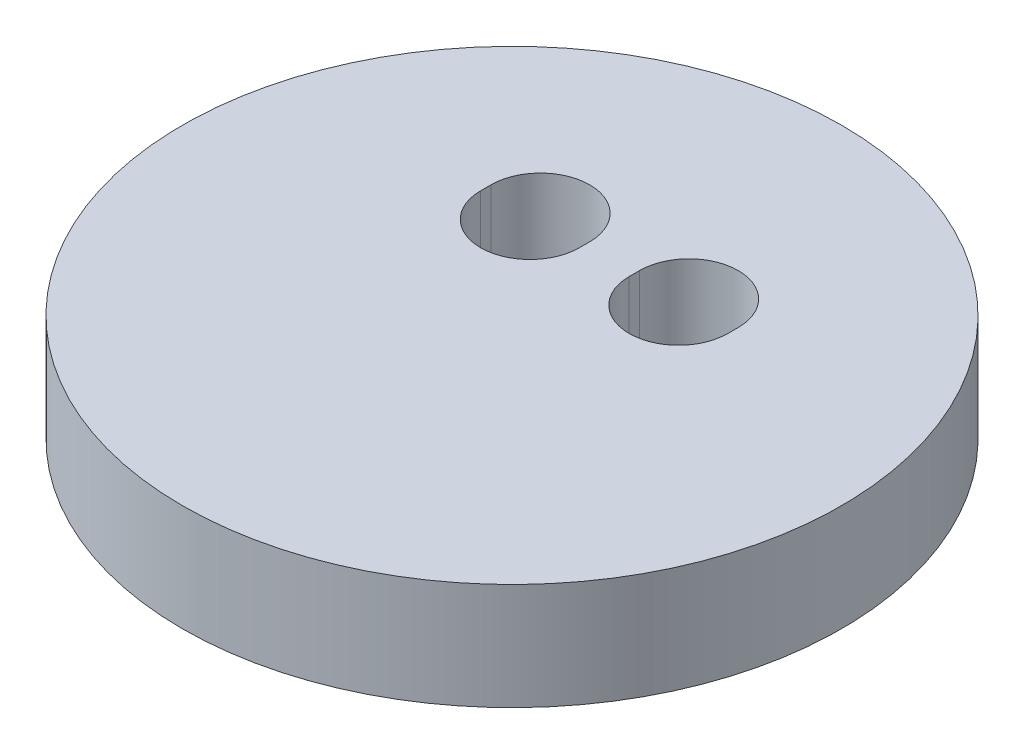
ISO-10303-21;
HEADER;
FILE_DESCRIPTION(('STEP AP214'),'2;1');
FILE_NAME('part.step','',(''),(''),'','','');
FILE_SCHEMA(('AUTOMOTIVE_DESIGN { 1 0 10303 214 1 1 1 1 }'));
ENDSEC;
DATA;
#1=APPLICATION_CONTEXT('core data for automotive mechanical design processes');
#2=APPLICATION_PROTOCOL_DEFINITION('international standard','automotive_design',2000,#1);
#3=PRODUCT_CONTEXT('',#1,'mechanical');
#4=PRODUCT('Part','Part','',(#3));
#5=PRODUCT_RELATED_PRODUCT_CATEGORY('part','',(#4));
#6=PRODUCT_DEFINITION_FORMATION('','',#4);
#7=PRODUCT_DEFINITION_CONTEXT('part definition',#1,'design');
#8=PRODUCT_DEFINITION('design','',#6,#7);
#9=PRODUCT_DEFINITION_SHAPE('','',#8);
#10=(LENGTH_UNIT() NAMED_UNIT(*) SI_UNIT(.MILLI.,.METRE.));
#11=(NAMED_UNIT(*) PLANE_ANGLE_UNIT() SI_UNIT($,.RADIAN.));
#12=(NAMED_UNIT(*) SI_UNIT($,.STERADIAN.) SOLID_ANGLE_UNIT());
#13=UNCERTAINTY_MEASURE_WITH_UNIT(LENGTH_MEASURE(1.E-05),#10,'distance_accuracy_value','');
#14=(GEOMETRIC_REPRESENTATION_CONTEXT(3) GLOBAL_UNCERTAINTY_ASSIGNED_CONTEXT((#13)) GLOBAL_UNIT_ASSIGNED_CONTEXT((#10,
#11,#12)) REPRESENTATION_CONTEXT('',''));
#15=CARTESIAN_POINT('',(0.,0.,0.));
#16=DIRECTION('',(0.,0.,1.));
#17=DIRECTION('',(1.,0.,0.));
#18=AXIS2_PLACEMENT_3D('',#15,#16,#17);
#19=CARTESIAN_POINT('',(0.,4.,0.));
#20=DIRECTION('',(0.,-1.,0.));
#21=DIRECTION('',(0.,0.,-1.));
#22=AXIS2_PLACEMENT_3D('',#19,#20,#21);
#23=CYLINDRICAL_SURFACE('',#22,12.36);
#24=CARTESIAN_POINT('',(0.,4.,0.));
#25=DIRECTION('',(0.,1.,0.));
#26=DIRECTION('',(0.,0.,1.));
#27=AXIS2_PLACEMENT_3D('',#24,#25,#26);
#28=CIRCLE('',#27,12.36);
#29=CARTESIAN_POINT('',(0.,4.,12.36));
#30=VERTEX_POINT('',#29);
#31=EDGE_CURVE('E11',#30,#30,#28,.T.);
#32=ORIENTED_EDGE('',*,*,#31,.F.);
#33=EDGE_LOOP('',(#32));
#34=FACE_BOUND('',#33,.T.);
#35=CARTESIAN_POINT('',(0.,0.,0.));
#36=DIRECTION('',(0.,1.,0.));
#37=DIRECTION('',(0.,0.,1.));
#38=AXIS2_PLACEMENT_3D('',#35,#36,#37);
#39=CIRCLE('',#38,12.36);
#40=CARTESIAN_POINT('',(0.,0.,12.36));
#41=VERTEX_POINT('',#40);
#42=EDGE_CURVE('E46',#41,#41,#39,.T.);
#43=ORIENTED_EDGE('',*,*,#42,.T.);
#44=EDGE_LOOP('',(#43));
#45=FACE_BOUND('',#44,.T.);
#46=ADVANCED_FACE('F43',(#34,#45),#23,.T.);
#47=CARTESIAN_POINT('',(0.,4.,0.));
#48=DIRECTION('',(0.,1.,0.));
#49=DIRECTION('',(0.,0.,1.));
#50=AXIS2_PLACEMENT_3D('',#47,#48,#49);
#51=PLANE('',#50);
#52=CARTESIAN_POINT('',(-2.785,4.,-3.85));
#53=DIRECTION('',(0.,1.,0.));
#54=DIRECTION('',(0.,0.,1.));
#55=AXIS2_PLACEMENT_3D('',#52,#53,#54);
#56=CIRCLE('',#55,1.85);
#57=CARTESIAN_POINT('',(-0.935000000000001,4.,-3.85));
#58=VERTEX_POINT('',#57);
#59=CARTESIAN_POINT('',(-4.635,4.,-3.85));
#60=VERTEX_POINT('',#59);
#61=EDGE_CURVE('E58',#58,#60,#56,.T.);
#62=ORIENTED_EDGE('',*,*,#61,.F.);
#63=DIRECTION('',(0.,0.,-1.));
#64=VECTOR('',#63,1.);
#65=CARTESIAN_POINT('',(-0.935000000000001,4.,-3.85));
#66=LINE('',#65,#64);
#67=CARTESIAN_POINT('',(-0.935000000000001,4.,-3.46000000000001));
#68=VERTEX_POINT('',#67);
#69=EDGE_CURVE('E132',#68,#58,#66,.T.);
#70=ORIENTED_EDGE('',*,*,#69,.F.);
#71=CARTESIAN_POINT('',(-2.785,4.,-3.46));
#72=DIRECTION('',(0.,1.,0.));
#73=DIRECTION('',(0.,0.,1.));
#74=AXIS2_PLACEMENT_3D('',#71,#72,#73);
#75=CIRCLE('',#74,1.85);
#76=CARTESIAN_POINT('',(-4.635,4.,-3.46));
#77=VERTEX_POINT('',#76);
#78=EDGE_CURVE('E136',#77,#68,#75,.T.);
#79=ORIENTED_EDGE('',*,*,#78,.F.);
#80=DIRECTION('',(0.,0.,1.));
#81=VECTOR('',#80,1.);
#82=CARTESIAN_POINT('',(-4.635,4.,-3.85));
#83=LINE('',#82,#81);
#84=EDGE_CURVE('E145',#60,#77,#83,.T.);
#85=ORIENTED_EDGE('',*,*,#84,.F.);
#86=EDGE_LOOP('',(#62,#70,#79,#85));
#87=FACE_BOUND('',#86,.T.);
#88=CARTESIAN_POINT('',(2.785,4.,-3.85));
#89=DIRECTION('',(0.,1.,0.));
#90=DIRECTION('',(0.,0.,1.));
#91=AXIS2_PLACEMENT_3D('',#88,#89,#90);
#92=CIRCLE('',#91,1.85);
#93=CARTESIAN_POINT('',(4.635,4.,-3.85));
#94=VERTEX_POINT('',#93);
#95=CARTESIAN_POINT('',(0.934999999999997,4.,-3.85));
#96=VERTEX_POINT('',#95);
#97=EDGE_CURVE('E66',#94,#96,#92,.T.);
#98=ORIENTED_EDGE('',*,*,#97,.F.);
#99=DIRECTION('',(0.,0.,-1.));
#100=VECTOR('',#99,1.);
#101=CARTESIAN_POINT('',(4.635,4.,-3.85));
#102=LINE('',#101,#100);
#103=CARTESIAN_POINT('',(4.635,4.,-3.46));
#104=VERTEX_POINT('',#103);
#105=EDGE_CURVE('E172',#104,#94,#102,.T.);
#106=ORIENTED_EDGE('',*,*,#105,.F.);
#107=CARTESIAN_POINT('',(2.785,4.,-3.46));
#108=DIRECTION('',(0.,1.,0.));
#109=DIRECTION('',(0.,0.,1.));
#110=AXIS2_PLACEMENT_3D('',#107,#108,#109);
#111=CIRCLE('',#110,1.85);
#112=CARTESIAN_POINT('',(0.934999999999996,4.,-3.46));
#113=VERTEX_POINT('',#112);
#114=EDGE_CURVE('E176',#113,#104,#111,.T.);
#115=ORIENTED_EDGE('',*,*,#114,.F.);
#116=DIRECTION('',(0.,0.,1.));
#117=VECTOR('',#116,1.);
#118=CARTESIAN_POINT('',(0.934999999999997,4.,-3.85));
#119=LINE('',#118,#117);
#120=EDGE_CURVE('E181',#96,#113,#119,.T.);
#121=ORIENTED_EDGE('',*,*,#120,.F.);
#122=EDGE_LOOP('',(#98,#106,#115,#121));
#123=FACE_BOUND('',#122,.T.);
#124=ORIENTED_EDGE('',*,*,#31,.T.);
#125=EDGE_LOOP('',(#124));
#126=FACE_BOUND('',#125,.T.);
#127=ADVANCED_FACE('F216',(#87,#123,#126),#51,.T.);
#128=CARTESIAN_POINT('',(0.,0.,0.));
#129=DIRECTION('',(0.,1.,0.));
#130=DIRECTION('',(0.,0.,1.));
#131=AXIS2_PLACEMENT_3D('',#128,#129,#130);
#132=PLANE('',#131);
#133=DIRECTION('',(0.,0.,-1.));
#134=VECTOR('',#133,1.);
#135=CARTESIAN_POINT('',(-0.935000000000001,0.,-3.85));
#136=LINE('',#135,#134);
#137=CARTESIAN_POINT('',(-0.935000000000001,0.,-3.46000000000001));
#138=VERTEX_POINT('',#137);
#139=CARTESIAN_POINT('',(-0.935000000000001,0.,-3.85));
#140=VERTEX_POINT('',#139);
#141=EDGE_CURVE('E117',#138,#140,#136,.T.);
#142=ORIENTED_EDGE('',*,*,#141,.T.);
#143=CARTESIAN_POINT('',(-2.785,0.,-3.85));
#144=DIRECTION('',(0.,1.,0.));
#145=DIRECTION('',(0.,0.,1.));
#146=AXIS2_PLACEMENT_3D('',#143,#144,#145);
#147=CIRCLE('',#146,1.85);
#148=CARTESIAN_POINT('',(-4.635,0.,-3.85));
#149=VERTEX_POINT('',#148);
#150=EDGE_CURVE('E110',#140,#149,#147,.T.);
#151=ORIENTED_EDGE('',*,*,#150,.T.);
#152=DIRECTION('',(0.,0.,1.));
#153=VECTOR('',#152,1.);
#154=CARTESIAN_POINT('',(-4.635,0.,-3.85));
#155=LINE('',#154,#153);
#156=CARTESIAN_POINT('',(-4.635,0.,-3.46));
#157=VERTEX_POINT('',#156);
#158=EDGE_CURVE('E121',#149,#157,#155,.T.);
#159=ORIENTED_EDGE('',*,*,#158,.T.);
#160=CARTESIAN_POINT('',(-2.785,0.,-3.46));
#161=DIRECTION('',(0.,1.,0.));
#162=DIRECTION('',(0.,0.,1.));
#163=AXIS2_PLACEMENT_3D('',#160,#161,#162);
#164=CIRCLE('',#163,1.85);
#165=EDGE_CURVE('E126',#157,#138,#164,.T.);
#166=ORIENTED_EDGE('',*,*,#165,.T.);
#167=EDGE_LOOP('',(#142,#151,#159,#166));
#168=FACE_BOUND('',#167,.T.);
#169=DIRECTION('',(0.,0.,-1.));
#170=VECTOR('',#169,1.);
#171=CARTESIAN_POINT('',(4.635,0.,-3.85));
#172=LINE('',#171,#170);
#173=CARTESIAN_POINT('',(4.635,0.,-3.46));
#174=VERTEX_POINT('',#173);
#175=CARTESIAN_POINT('',(4.635,0.,-3.85));
#176=VERTEX_POINT('',#175);
#177=EDGE_CURVE('E162',#174,#176,#172,.T.);
#178=ORIENTED_EDGE('',*,*,#177,.T.);
#179=CARTESIAN_POINT('',(2.785,0.,-3.85));
#180=DIRECTION('',(0.,1.,0.));
#181=DIRECTION('',(0.,0.,1.));
#182=AXIS2_PLACEMENT_3D('',#179,#180,#181);
#183=CIRCLE('',#182,1.85);
#184=CARTESIAN_POINT('',(0.934999999999997,0.,-3.85));
#185=VERTEX_POINT('',#184);
#186=EDGE_CURVE('E177',#176,#185,#183,.T.);
#187=ORIENTED_EDGE('',*,*,#186,.T.);
#188=DIRECTION('',(0.,0.,1.));
#189=VECTOR('',#188,1.);
#190=CARTESIAN_POINT('',(0.934999999999997,0.,-3.85));
#191=LINE('',#190,#189);
#192=CARTESIAN_POINT('',(0.934999999999997,0.,-3.46));
#193=VERTEX_POINT('',#192);
#194=EDGE_CURVE('E194',#185,#193,#191,.T.);
#195=ORIENTED_EDGE('',*,*,#194,.T.);
#196=CARTESIAN_POINT('',(2.785,0.,-3.46));
#197=DIRECTION('',(0.,1.,0.));
#198=DIRECTION('',(0.,0.,1.));
#199=AXIS2_PLACEMENT_3D('',#196,#197,#198);
#200=CIRCLE('',#199,1.85);
#201=EDGE_CURVE('E190',#193,#174,#200,.T.);
#202=ORIENTED_EDGE('',*,*,#201,.T.);
#203=EDGE_LOOP('',(#178,#187,#195,#202));
#204=FACE_BOUND('',#203,.T.);
#205=ORIENTED_EDGE('',*,*,#42,.F.);
#206=EDGE_LOOP('',(#205));
#207=FACE_BOUND('',#206,.T.);
#208=ADVANCED_FACE('F128',(#168,#204,#207),#132,.F.);
#209=CARTESIAN_POINT('',(2.785,0.,-3.85));
#210=DIRECTION('',(0.,1.,0.));
#211=DIRECTION('',(0.,0.,1.));
#212=AXIS2_PLACEMENT_3D('',#209,#210,#211);
#213=CYLINDRICAL_SURFACE('',#212,1.85);
#214=ORIENTED_EDGE('',*,*,#97,.T.);
#215=DIRECTION('',(0.,1.,0.));
#216=VECTOR('',#215,1.);
#217=CARTESIAN_POINT('',(0.934999999999997,0.,-3.85));
#218=LINE('',#217,#216);
#219=EDGE_CURVE('E159',#185,#96,#218,.T.);
#220=ORIENTED_EDGE('',*,*,#219,.F.);
#221=ORIENTED_EDGE('',*,*,#186,.F.);
#222=DIRECTION('',(0.,1.,0.));
#223=VECTOR('',#222,1.);
#224=CARTESIAN_POINT('',(4.635,0.,-3.85));
#225=LINE('',#224,#223);
#226=EDGE_CURVE('E169',#176,#94,#225,.T.);
#227=ORIENTED_EDGE('',*,*,#226,.T.);
#228=EDGE_LOOP('',(#214,#220,#221,#227));
#229=FACE_BOUND('',#228,.T.);
#230=ADVANCED_FACE('F204',(#229),#213,.F.);
#231=CARTESIAN_POINT('',(4.635,0.,-3.85));
#232=DIRECTION('',(1.,0.,0.));
#233=DIRECTION('',(0.,0.,-1.));
#234=AXIS2_PLACEMENT_3D('',#231,#232,#233);
#235=PLANE('',#234);
#236=ORIENTED_EDGE('',*,*,#105,.T.);
#237=ORIENTED_EDGE('',*,*,#226,.F.);
#238=ORIENTED_EDGE('',*,*,#177,.F.);
#239=DIRECTION('',(0.,1.,0.));
#240=VECTOR('',#239,1.);
#241=CARTESIAN_POINT('',(4.635,0.,-3.46));
#242=LINE('',#241,#240);
#243=EDGE_CURVE('E166',#174,#104,#242,.T.);
#244=ORIENTED_EDGE('',*,*,#243,.T.);
#245=EDGE_LOOP('',(#236,#237,#238,#244));
#246=FACE_BOUND('',#245,.T.);
#247=ADVANCED_FACE('F214',(#246),#235,.F.);
#248=CARTESIAN_POINT('',(2.785,0.,-3.46));
#249=DIRECTION('',(0.,1.,0.));
#250=DIRECTION('',(0.,0.,1.));
#251=AXIS2_PLACEMENT_3D('',#248,#249,#250);
#252=CYLINDRICAL_SURFACE('',#251,1.85);
#253=ORIENTED_EDGE('',*,*,#114,.T.);
#254=ORIENTED_EDGE('',*,*,#243,.F.);
#255=ORIENTED_EDGE('',*,*,#201,.F.);
#256=DIRECTION('',(0.,1.,0.));
#257=VECTOR('',#256,1.);
#258=CARTESIAN_POINT('',(0.934999999999996,0.,-3.46));
#259=LINE('',#258,#257);
#260=EDGE_CURVE('E163',#193,#113,#259,.T.);
#261=ORIENTED_EDGE('',*,*,#260,.T.);
#262=EDGE_LOOP('',(#253,#254,#255,#261));
#263=FACE_BOUND('',#262,.T.);
#264=ADVANCED_FACE('F211',(#263),#252,.F.);
#265=CARTESIAN_POINT('',(0.934999999999997,0.,-3.85));
#266=DIRECTION('',(-1.,0.,0.));
#267=DIRECTION('',(0.,0.,1.));
#268=AXIS2_PLACEMENT_3D('',#265,#266,#267);
#269=PLANE('',#268);
#270=ORIENTED_EDGE('',*,*,#120,.T.);
#271=ORIENTED_EDGE('',*,*,#260,.F.);
#272=ORIENTED_EDGE('',*,*,#194,.F.);
#273=ORIENTED_EDGE('',*,*,#219,.T.);
#274=EDGE_LOOP('',(#270,#271,#272,#273));
#275=FACE_BOUND('',#274,.T.);
#276=ADVANCED_FACE('F208',(#275),#269,.F.);
#277=CARTESIAN_POINT('',(-2.785,0.,-3.85));
#278=DIRECTION('',(0.,1.,0.));
#279=DIRECTION('',(0.,0.,1.));
#280=AXIS2_PLACEMENT_3D('',#277,#278,#279);
#281=CYLINDRICAL_SURFACE('',#280,1.85);
#282=ORIENTED_EDGE('',*,*,#61,.T.);
#283=DIRECTION('',(0.,1.,0.));
#284=VECTOR('',#283,1.);
#285=CARTESIAN_POINT('',(-4.635,0.,-3.85));
#286=LINE('',#285,#284);
#287=EDGE_CURVE('E106',#149,#60,#286,.T.);
#288=ORIENTED_EDGE('',*,*,#287,.F.);
#289=ORIENTED_EDGE('',*,*,#150,.F.);
#290=DIRECTION('',(0.,1.,0.));
#291=VECTOR('',#290,1.);
#292=CARTESIAN_POINT('',(-0.935000000000001,0.,-3.85));
#293=LINE('',#292,#291);
#294=EDGE_CURVE('E151',#140,#58,#293,.T.);
#295=ORIENTED_EDGE('',*,*,#294,.T.);
#296=EDGE_LOOP('',(#282,#288,#289,#295));
#297=FACE_BOUND('',#296,.T.);
#298=ADVANCED_FACE('F108',(#297),#281,.F.);
#299=CARTESIAN_POINT('',(-0.935000000000001,0.,-3.85));
#300=DIRECTION('',(1.,0.,0.));
#301=DIRECTION('',(0.,0.,-1.));
#302=AXIS2_PLACEMENT_3D('',#299,#300,#301);
#303=PLANE('',#302);
#304=ORIENTED_EDGE('',*,*,#69,.T.);
#305=ORIENTED_EDGE('',*,*,#294,.F.);
#306=ORIENTED_EDGE('',*,*,#141,.F.);
#307=DIRECTION('',(0.,1.,0.));
#308=VECTOR('',#307,1.);
#309=CARTESIAN_POINT('',(-0.935000000000001,0.,-3.46000000000001));
#310=LINE('',#309,#308);
#311=EDGE_CURVE('E154',#138,#68,#310,.T.);
#312=ORIENTED_EDGE('',*,*,#311,.T.);
#313=EDGE_LOOP('',(#304,#305,#306,#312));
#314=FACE_BOUND('',#313,.T.);
#315=ADVANCED_FACE('F242',(#314),#303,.F.);
#316=CARTESIAN_POINT('',(-2.785,0.,-3.46));
#317=DIRECTION('',(0.,1.,0.));
#318=DIRECTION('',(0.,0.,1.));
#319=AXIS2_PLACEMENT_3D('',#316,#317,#318);
#320=CYLINDRICAL_SURFACE('',#319,1.85);
#321=ORIENTED_EDGE('',*,*,#78,.T.);
#322=ORIENTED_EDGE('',*,*,#311,.F.);
#323=ORIENTED_EDGE('',*,*,#165,.F.);
#324=DIRECTION('',(0.,1.,0.));
#325=VECTOR('',#324,1.);
#326=CARTESIAN_POINT('',(-4.635,0.,-3.46));
#327=LINE('',#326,#325);
#328=EDGE_CURVE('E116',#157,#77,#327,.T.);
#329=ORIENTED_EDGE('',*,*,#328,.T.);
#330=EDGE_LOOP('',(#321,#322,#323,#329));
#331=FACE_BOUND('',#330,.T.);
#332=ADVANCED_FACE('F245',(#331),#320,.F.);
#333=CARTESIAN_POINT('',(-4.635,0.,-3.85));
#334=DIRECTION('',(-1.,0.,0.));
#335=DIRECTION('',(0.,0.,1.));
#336=AXIS2_PLACEMENT_3D('',#333,#334,#335);
#337=PLANE('',#336);
#338=ORIENTED_EDGE('',*,*,#84,.T.);
#339=ORIENTED_EDGE('',*,*,#328,.F.);
#340=ORIENTED_EDGE('',*,*,#158,.F.);
#341=ORIENTED_EDGE('',*,*,#287,.T.);
#342=EDGE_LOOP('',(#338,#339,#340,#341));
#343=FACE_BOUND('',#342,.T.);
#344=ADVANCED_FACE('F122',(#343),#337,.F.);
#345=CLOSED_SHELL('',(#46,#127,#208,#230,#247,#264,#276,#298,#315,#332,#344));
#346=MANIFOLD_SOLID_BREP('B2',#345);
#347=ADVANCED_BREP_SHAPE_REPRESENTATION('',(#18,#346),#14);
#348=SHAPE_DEFINITION_REPRESENTATION(#9,#347);
ENDSEC;
END-ISO-10303-21;
